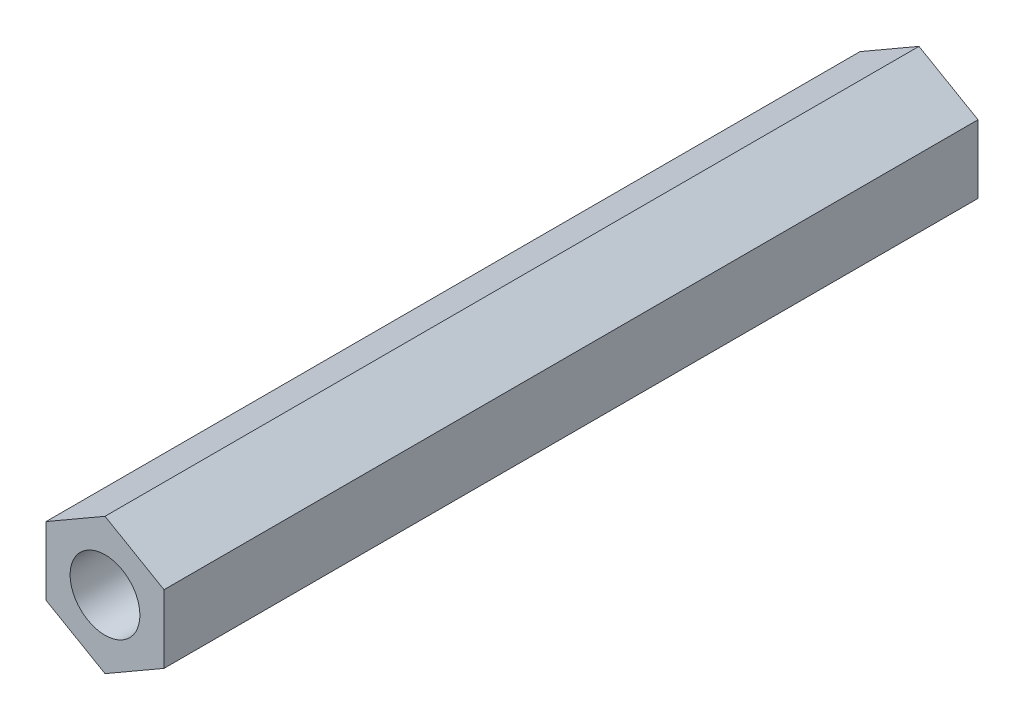
ISO-10303-21;
HEADER;
FILE_DESCRIPTION(('STEP AP214'),'2;1');
FILE_NAME('part.step','',(''),(''),'','','');
FILE_SCHEMA(('AUTOMOTIVE_DESIGN { 1 0 10303 214 1 1 1 1 }'));
ENDSEC;
DATA;
#1=APPLICATION_CONTEXT('core data for automotive mechanical design processes');
#2=APPLICATION_PROTOCOL_DEFINITION('international standard','automotive_design',2000,#1);
#3=PRODUCT_CONTEXT('',#1,'mechanical');
#4=PRODUCT('Part','Part','',(#3));
#5=PRODUCT_RELATED_PRODUCT_CATEGORY('part','',(#4));
#6=PRODUCT_DEFINITION_FORMATION('','',#4);
#7=PRODUCT_DEFINITION_CONTEXT('part definition',#1,'design');
#8=PRODUCT_DEFINITION('design','',#6,#7);
#9=PRODUCT_DEFINITION_SHAPE('','',#8);
#10=(LENGTH_UNIT() NAMED_UNIT(*) SI_UNIT(.MILLI.,.METRE.));
#11=(NAMED_UNIT(*) PLANE_ANGLE_UNIT() SI_UNIT($,.RADIAN.));
#12=(NAMED_UNIT(*) SI_UNIT($,.STERADIAN.) SOLID_ANGLE_UNIT());
#13=UNCERTAINTY_MEASURE_WITH_UNIT(LENGTH_MEASURE(1.E-05),#10,'distance_accuracy_value','');
#14=(GEOMETRIC_REPRESENTATION_CONTEXT(3) GLOBAL_UNCERTAINTY_ASSIGNED_CONTEXT((#13)) GLOBAL_UNIT_ASSIGNED_CONTEXT((#10,
#11,#12)) REPRESENTATION_CONTEXT('',''));
#15=CARTESIAN_POINT('',(0.,0.,0.));
#16=DIRECTION('',(0.,0.,1.));
#17=DIRECTION('',(1.,0.,0.));
#18=AXIS2_PLACEMENT_3D('',#15,#16,#17);
#19=CARTESIAN_POINT('',(0.,0.,35.));
#20=DIRECTION('',(0.,0.,1.));
#21=DIRECTION('',(1.,0.,0.));
#22=AXIS2_PLACEMENT_3D('',#19,#20,#21);
#23=PLANE('',#22);
#24=DIRECTION('',(0.866025403784439,0.5,0.));
#25=VECTOR('',#24,1.);
#26=CARTESIAN_POINT('',(0.,-2.93,35.));
#27=LINE('',#26,#25);
#28=CARTESIAN_POINT('',(0.,-2.93,35.));
#29=VERTEX_POINT('',#28);
#30=CARTESIAN_POINT('',(2.53745443308841,-1.465,35.));
#31=VERTEX_POINT('',#30);
#32=EDGE_CURVE('E129',#29,#31,#27,.T.);
#33=ORIENTED_EDGE('',*,*,#32,.T.);
#34=DIRECTION('',(0.,1.,0.));
#35=VECTOR('',#34,1.);
#36=CARTESIAN_POINT('',(2.53745443308841,-1.465,35.));
#37=LINE('',#36,#35);
#38=CARTESIAN_POINT('',(2.53745443308841,1.465,35.));
#39=VERTEX_POINT('',#38);
#40=EDGE_CURVE('E87',#31,#39,#37,.T.);
#41=ORIENTED_EDGE('',*,*,#40,.T.);
#42=DIRECTION('',(-0.866025403784439,0.5,0.));
#43=VECTOR('',#42,1.);
#44=CARTESIAN_POINT('',(2.53745443308841,1.465,35.));
#45=LINE('',#44,#43);
#46=CARTESIAN_POINT('',(0.,2.93,35.));
#47=VERTEX_POINT('',#46);
#48=EDGE_CURVE('E100',#39,#47,#45,.T.);
#49=ORIENTED_EDGE('',*,*,#48,.T.);
#50=DIRECTION('',(-0.866025403784439,-0.5,0.));
#51=VECTOR('',#50,1.);
#52=CARTESIAN_POINT('',(0.,2.93,35.));
#53=LINE('',#52,#51);
#54=CARTESIAN_POINT('',(-2.5374544330884,1.465,35.));
#55=VERTEX_POINT('',#54);
#56=EDGE_CURVE('E94',#47,#55,#53,.T.);
#57=ORIENTED_EDGE('',*,*,#56,.T.);
#58=DIRECTION('',(0.,-1.,0.));
#59=VECTOR('',#58,1.);
#60=CARTESIAN_POINT('',(-2.5374544330884,1.465,35.));
#61=LINE('',#60,#59);
#62=CARTESIAN_POINT('',(-2.5374544330884,-1.465,35.));
#63=VERTEX_POINT('',#62);
#64=EDGE_CURVE('E98',#55,#63,#61,.T.);
#65=ORIENTED_EDGE('',*,*,#64,.T.);
#66=DIRECTION('',(0.866025403784439,-0.5,0.));
#67=VECTOR('',#66,1.);
#68=CARTESIAN_POINT('',(-2.5374544330884,-1.465,35.));
#69=LINE('',#68,#67);
#70=EDGE_CURVE('E50',#63,#29,#69,.T.);
#71=ORIENTED_EDGE('',*,*,#70,.T.);
#72=EDGE_LOOP('',(#33,#41,#49,#57,#65,#71));
#73=FACE_BOUND('',#72,.T.);
#74=CARTESIAN_POINT('',(0.,0.,35.));
#75=DIRECTION('',(0.,0.,1.));
#76=DIRECTION('',(1.,0.,0.));
#77=AXIS2_PLACEMENT_3D('',#74,#75,#76);
#78=CIRCLE('',#77,1.5);
#79=CARTESIAN_POINT('',(1.5,0.,35.));
#80=VERTEX_POINT('',#79);
#81=EDGE_CURVE('E122',#80,#80,#78,.T.);
#82=ORIENTED_EDGE('',*,*,#81,.F.);
#83=EDGE_LOOP('',(#82));
#84=FACE_BOUND('',#83,.T.);
#85=ADVANCED_FACE('F33',(#73,#84),#23,.T.);
#86=CARTESIAN_POINT('',(0.,0.,0.));
#87=DIRECTION('',(0.,0.,1.));
#88=DIRECTION('',(1.,0.,0.));
#89=AXIS2_PLACEMENT_3D('',#86,#87,#88);
#90=PLANE('',#89);
#91=DIRECTION('',(0.866025403784439,0.5,0.));
#92=VECTOR('',#91,1.);
#93=CARTESIAN_POINT('',(0.,-2.93,0.));
#94=LINE('',#93,#92);
#95=CARTESIAN_POINT('',(0.,-2.93,0.));
#96=VERTEX_POINT('',#95);
#97=CARTESIAN_POINT('',(2.53745443308841,-1.465,0.));
#98=VERTEX_POINT('',#97);
#99=EDGE_CURVE('E118',#96,#98,#94,.T.);
#100=ORIENTED_EDGE('',*,*,#99,.F.);
#101=DIRECTION('',(0.866025403784439,-0.5,0.));
#102=VECTOR('',#101,1.);
#103=CARTESIAN_POINT('',(-2.5374544330884,-1.465,0.));
#104=LINE('',#103,#102);
#105=CARTESIAN_POINT('',(-2.5374544330884,-1.465,0.));
#106=VERTEX_POINT('',#105);
#107=EDGE_CURVE('E79',#106,#96,#104,.T.);
#108=ORIENTED_EDGE('',*,*,#107,.F.);
#109=DIRECTION('',(0.,-1.,0.));
#110=VECTOR('',#109,1.);
#111=CARTESIAN_POINT('',(-2.5374544330884,1.465,0.));
#112=LINE('',#111,#110);
#113=CARTESIAN_POINT('',(-2.5374544330884,1.465,0.));
#114=VERTEX_POINT('',#113);
#115=EDGE_CURVE('E73',#114,#106,#112,.T.);
#116=ORIENTED_EDGE('',*,*,#115,.F.);
#117=DIRECTION('',(-0.866025403784439,-0.5,0.));
#118=VECTOR('',#117,1.);
#119=CARTESIAN_POINT('',(0.,2.93,0.));
#120=LINE('',#119,#118);
#121=CARTESIAN_POINT('',(0.,2.93,0.));
#122=VERTEX_POINT('',#121);
#123=EDGE_CURVE('E108',#122,#114,#120,.T.);
#124=ORIENTED_EDGE('',*,*,#123,.F.);
#125=DIRECTION('',(-0.866025403784439,0.5,0.));
#126=VECTOR('',#125,1.);
#127=CARTESIAN_POINT('',(2.53745443308841,1.465,0.));
#128=LINE('',#127,#126);
#129=CARTESIAN_POINT('',(2.53745443308841,1.465,0.));
#130=VERTEX_POINT('',#129);
#131=EDGE_CURVE('E124',#130,#122,#128,.T.);
#132=ORIENTED_EDGE('',*,*,#131,.F.);
#133=DIRECTION('',(0.,1.,0.));
#134=VECTOR('',#133,1.);
#135=CARTESIAN_POINT('',(2.53745443308841,-1.465,0.));
#136=LINE('',#135,#134);
#137=EDGE_CURVE('E121',#98,#130,#136,.T.);
#138=ORIENTED_EDGE('',*,*,#137,.F.);
#139=EDGE_LOOP('',(#100,#108,#116,#124,#132,#138));
#140=FACE_BOUND('',#139,.T.);
#141=CARTESIAN_POINT('',(0.,0.,0.));
#142=DIRECTION('',(0.,0.,1.));
#143=DIRECTION('',(1.,0.,0.));
#144=AXIS2_PLACEMENT_3D('',#141,#142,#143);
#145=CIRCLE('',#144,1.5);
#146=CARTESIAN_POINT('',(1.5,0.,0.));
#147=VERTEX_POINT('',#146);
#148=EDGE_CURVE('E222',#147,#147,#145,.T.);
#149=ORIENTED_EDGE('',*,*,#148,.T.);
#150=EDGE_LOOP('',(#149));
#151=FACE_BOUND('',#150,.T.);
#152=ADVANCED_FACE('F138',(#140,#151),#90,.F.);
#153=CARTESIAN_POINT('',(0.,-2.93,35.));
#154=DIRECTION('',(-0.5,0.866025403784439,0.));
#155=DIRECTION('',(-0.866025403784439,-0.5,0.));
#156=AXIS2_PLACEMENT_3D('',#153,#154,#155);
#157=PLANE('',#156);
#158=ORIENTED_EDGE('',*,*,#99,.T.);
#159=DIRECTION('',(0.,0.,-1.));
#160=VECTOR('',#159,1.);
#161=CARTESIAN_POINT('',(2.53745443308841,-1.465,35.));
#162=LINE('',#161,#160);
#163=EDGE_CURVE('E11',#31,#98,#162,.T.);
#164=ORIENTED_EDGE('',*,*,#163,.F.);
#165=ORIENTED_EDGE('',*,*,#32,.F.);
#166=DIRECTION('',(0.,0.,-1.));
#167=VECTOR('',#166,1.);
#168=CARTESIAN_POINT('',(0.,-2.93,35.));
#169=LINE('',#168,#167);
#170=EDGE_CURVE('E114',#29,#96,#169,.T.);
#171=ORIENTED_EDGE('',*,*,#170,.T.);
#172=EDGE_LOOP('',(#158,#164,#165,#171));
#173=FACE_BOUND('',#172,.T.);
#174=ADVANCED_FACE('F35',(#173),#157,.F.);
#175=CARTESIAN_POINT('',(2.53745443308841,-1.465,35.));
#176=DIRECTION('',(-1.,0.,0.));
#177=DIRECTION('',(0.,-1.,0.));
#178=AXIS2_PLACEMENT_3D('',#175,#176,#177);
#179=PLANE('',#178);
#180=ORIENTED_EDGE('',*,*,#137,.T.);
#181=DIRECTION('',(0.,0.,-1.));
#182=VECTOR('',#181,1.);
#183=CARTESIAN_POINT('',(2.53745443308841,1.465,35.));
#184=LINE('',#183,#182);
#185=EDGE_CURVE('E42',#39,#130,#184,.T.);
#186=ORIENTED_EDGE('',*,*,#185,.F.);
#187=ORIENTED_EDGE('',*,*,#40,.F.);
#188=ORIENTED_EDGE('',*,*,#163,.T.);
#189=EDGE_LOOP('',(#180,#186,#187,#188));
#190=FACE_BOUND('',#189,.T.);
#191=ADVANCED_FACE('F163',(#190),#179,.F.);
#192=CARTESIAN_POINT('',(2.53745443308841,1.465,35.));
#193=DIRECTION('',(-0.5,-0.866025403784439,0.));
#194=DIRECTION('',(0.866025403784439,-0.5,0.));
#195=AXIS2_PLACEMENT_3D('',#192,#193,#194);
#196=PLANE('',#195);
#197=ORIENTED_EDGE('',*,*,#131,.T.);
#198=DIRECTION('',(0.,0.,-1.));
#199=VECTOR('',#198,1.);
#200=CARTESIAN_POINT('',(0.,2.93,35.));
#201=LINE('',#200,#199);
#202=EDGE_CURVE('E109',#47,#122,#201,.T.);
#203=ORIENTED_EDGE('',*,*,#202,.F.);
#204=ORIENTED_EDGE('',*,*,#48,.F.);
#205=ORIENTED_EDGE('',*,*,#185,.T.);
#206=EDGE_LOOP('',(#197,#203,#204,#205));
#207=FACE_BOUND('',#206,.T.);
#208=ADVANCED_FACE('F135',(#207),#196,.F.);
#209=CARTESIAN_POINT('',(0.,2.93,35.));
#210=DIRECTION('',(0.5,-0.866025403784439,0.));
#211=DIRECTION('',(0.866025403784439,0.5,0.));
#212=AXIS2_PLACEMENT_3D('',#209,#210,#211);
#213=PLANE('',#212);
#214=ORIENTED_EDGE('',*,*,#123,.T.);
#215=DIRECTION('',(0.,0.,-1.));
#216=VECTOR('',#215,1.);
#217=CARTESIAN_POINT('',(-2.5374544330884,1.465,35.));
#218=LINE('',#217,#216);
#219=EDGE_CURVE('E105',#55,#114,#218,.T.);
#220=ORIENTED_EDGE('',*,*,#219,.F.);
#221=ORIENTED_EDGE('',*,*,#56,.F.);
#222=ORIENTED_EDGE('',*,*,#202,.T.);
#223=EDGE_LOOP('',(#214,#220,#221,#222));
#224=FACE_BOUND('',#223,.T.);
#225=ADVANCED_FACE('F106',(#224),#213,.F.);
#226=CARTESIAN_POINT('',(-2.5374544330884,1.465,35.));
#227=DIRECTION('',(1.,0.,0.));
#228=DIRECTION('',(0.,1.,0.));
#229=AXIS2_PLACEMENT_3D('',#226,#227,#228);
#230=PLANE('',#229);
#231=ORIENTED_EDGE('',*,*,#115,.T.);
#232=DIRECTION('',(0.,0.,-1.));
#233=VECTOR('',#232,1.);
#234=CARTESIAN_POINT('',(-2.5374544330884,-1.465,35.));
#235=LINE('',#234,#233);
#236=EDGE_CURVE('E110',#63,#106,#235,.T.);
#237=ORIENTED_EDGE('',*,*,#236,.F.);
#238=ORIENTED_EDGE('',*,*,#64,.F.);
#239=ORIENTED_EDGE('',*,*,#219,.T.);
#240=EDGE_LOOP('',(#231,#237,#238,#239));
#241=FACE_BOUND('',#240,.T.);
#242=ADVANCED_FACE('F112',(#241),#230,.F.);
#243=CARTESIAN_POINT('',(-2.5374544330884,-1.465,35.));
#244=DIRECTION('',(0.5,0.866025403784439,0.));
#245=DIRECTION('',(-0.866025403784439,0.5,0.));
#246=AXIS2_PLACEMENT_3D('',#243,#244,#245);
#247=PLANE('',#246);
#248=ORIENTED_EDGE('',*,*,#107,.T.);
#249=ORIENTED_EDGE('',*,*,#170,.F.);
#250=ORIENTED_EDGE('',*,*,#70,.F.);
#251=ORIENTED_EDGE('',*,*,#236,.T.);
#252=EDGE_LOOP('',(#248,#249,#250,#251));
#253=FACE_BOUND('',#252,.T.);
#254=ADVANCED_FACE('F143',(#253),#247,.F.);
#255=CARTESIAN_POINT('',(0.,0.,35.));
#256=DIRECTION('',(0.,0.,-1.));
#257=DIRECTION('',(-1.,0.,0.));
#258=AXIS2_PLACEMENT_3D('',#255,#256,#257);
#259=CYLINDRICAL_SURFACE('',#258,1.5);
#260=ORIENTED_EDGE('',*,*,#81,.T.);
#261=EDGE_LOOP('',(#260));
#262=FACE_BOUND('',#261,.T.);
#263=ORIENTED_EDGE('',*,*,#148,.F.);
#264=EDGE_LOOP('',(#263));
#265=FACE_BOUND('',#264,.T.);
#266=ADVANCED_FACE('F145',(#262,#265),#259,.F.);
#267=CLOSED_SHELL('',(#85,#152,#174,#191,#208,#225,#242,#254,#266));
#268=MANIFOLD_SOLID_BREP('B2',#267);
#269=ADVANCED_BREP_SHAPE_REPRESENTATION('',(#18,#268),#14);
#270=SHAPE_DEFINITION_REPRESENTATION(#9,#269);
ENDSEC;
END-ISO-10303-21;
